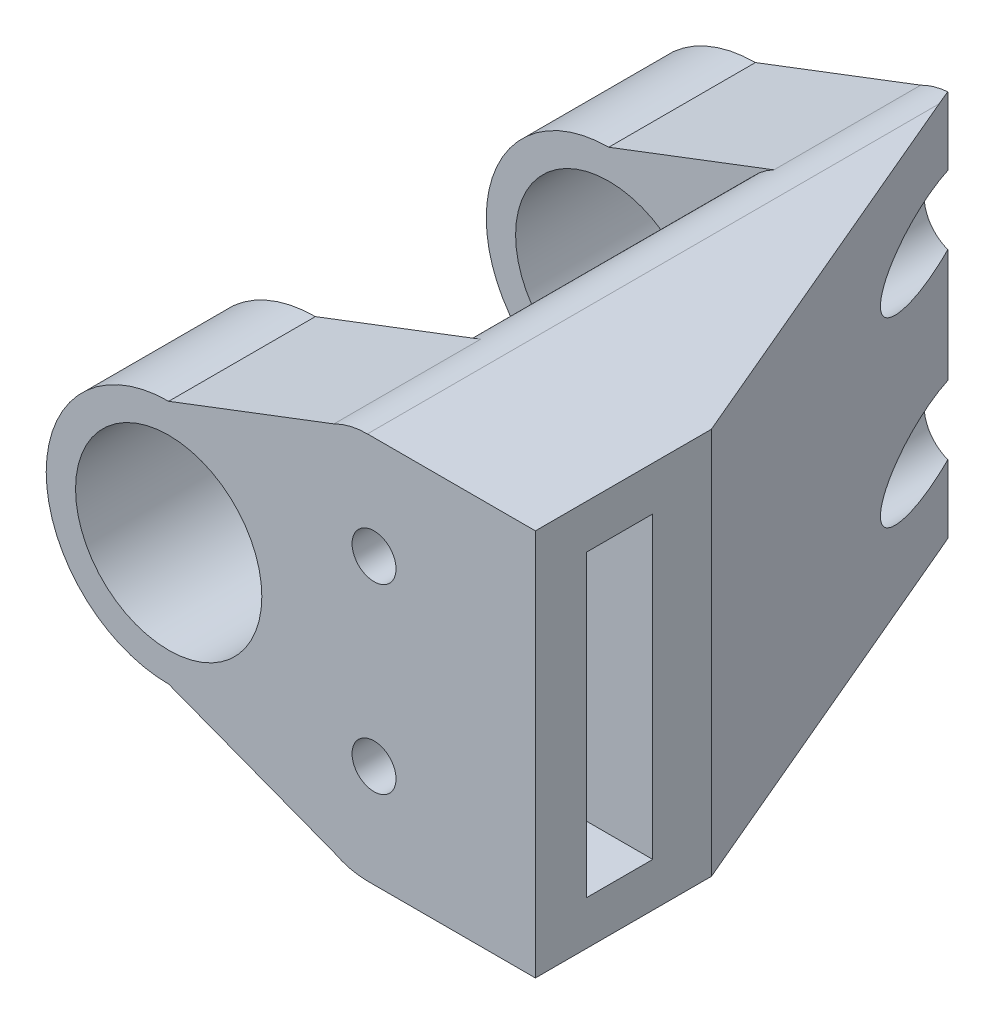
ISO-10303-21;
HEADER;
FILE_DESCRIPTION(('STEP AP214'),'2;1');
FILE_NAME('part.step','',(''),(''),'','','');
FILE_SCHEMA(('AUTOMOTIVE_DESIGN { 1 0 10303 214 1 1 1 1 }'));
ENDSEC;
DATA;
#1=APPLICATION_CONTEXT('core data for automotive mechanical design processes');
#2=APPLICATION_PROTOCOL_DEFINITION('international standard','automotive_design',2000,#1);
#3=PRODUCT_CONTEXT('',#1,'mechanical');
#4=PRODUCT('Part','Part','',(#3));
#5=PRODUCT_RELATED_PRODUCT_CATEGORY('part','',(#4));
#6=PRODUCT_DEFINITION_FORMATION('','',#4);
#7=PRODUCT_DEFINITION_CONTEXT('part definition',#1,'design');
#8=PRODUCT_DEFINITION('design','',#6,#7);
#9=PRODUCT_DEFINITION_SHAPE('','',#8);
#10=(LENGTH_UNIT() NAMED_UNIT(*) SI_UNIT(.MILLI.,.METRE.));
#11=(NAMED_UNIT(*) PLANE_ANGLE_UNIT() SI_UNIT($,.RADIAN.));
#12=(NAMED_UNIT(*) SI_UNIT($,.STERADIAN.) SOLID_ANGLE_UNIT());
#13=UNCERTAINTY_MEASURE_WITH_UNIT(LENGTH_MEASURE(1.E-05),#10,'distance_accuracy_value','');
#14=(GEOMETRIC_REPRESENTATION_CONTEXT(3) GLOBAL_UNCERTAINTY_ASSIGNED_CONTEXT((#13)) GLOBAL_UNIT_ASSIGNED_CONTEXT((#10,
#11,#12)) REPRESENTATION_CONTEXT('',''));
#15=CARTESIAN_POINT('',(0.,0.,0.));
#16=DIRECTION('',(0.,0.,1.));
#17=DIRECTION('',(1.,0.,0.));
#18=AXIS2_PLACEMENT_3D('',#15,#16,#17);
#19=CARTESIAN_POINT('',(4.,-6.2,-40.));
#20=DIRECTION('',(0.,0.,1.));
#21=DIRECTION('',(1.,0.,0.));
#22=AXIS2_PLACEMENT_3D('',#19,#20,#21);
#23=CYLINDRICAL_SURFACE('',#22,1.5);
#24=CARTESIAN_POINT('',(4.,-6.2,-8.));
#25=DIRECTION('',(0.,0.,1.));
#26=DIRECTION('',(1.,0.,0.));
#27=AXIS2_PLACEMENT_3D('',#24,#25,#26);
#28=CIRCLE('',#27,1.5);
#29=CARTESIAN_POINT('',(5.5,-6.2,-8.));
#30=VERTEX_POINT('',#29);
#31=EDGE_CURVE('E219',#30,#30,#28,.T.);
#32=ORIENTED_EDGE('',*,*,#31,.T.);
#33=EDGE_LOOP('',(#32));
#34=FACE_BOUND('',#33,.T.);
#35=CARTESIAN_POINT('',(4.,-6.2,-20.));
#36=DIRECTION('',(0.,0.,-1.));
#37=DIRECTION('',(-1.,0.,0.));
#38=AXIS2_PLACEMENT_3D('',#35,#36,#37);
#39=CIRCLE('',#38,1.5);
#40=CARTESIAN_POINT('',(2.5,-6.2,-20.));
#41=VERTEX_POINT('',#40);
#42=EDGE_CURVE('E121',#41,#41,#39,.F.);
#43=ORIENTED_EDGE('',*,*,#42,.F.);
#44=EDGE_LOOP('',(#43));
#45=FACE_BOUND('',#44,.T.);
#46=ADVANCED_FACE('F50',(#34,#45),#23,.F.);
#47=CARTESIAN_POINT('',(4.,6.2,-40.));
#48=DIRECTION('',(0.,0.,1.));
#49=DIRECTION('',(1.,0.,0.));
#50=AXIS2_PLACEMENT_3D('',#47,#48,#49);
#51=CYLINDRICAL_SURFACE('',#50,1.5);
#52=CARTESIAN_POINT('',(4.,6.2,-8.));
#53=DIRECTION('',(0.,0.,1.));
#54=DIRECTION('',(1.,0.,0.));
#55=AXIS2_PLACEMENT_3D('',#52,#53,#54);
#56=CIRCLE('',#55,1.5);
#57=CARTESIAN_POINT('',(5.5,6.2,-8.));
#58=VERTEX_POINT('',#57);
#59=EDGE_CURVE('E222',#58,#58,#56,.T.);
#60=ORIENTED_EDGE('',*,*,#59,.T.);
#61=EDGE_LOOP('',(#60));
#62=FACE_BOUND('',#61,.T.);
#63=CARTESIAN_POINT('',(4.,6.2,-20.));
#64=DIRECTION('',(0.,0.,-1.));
#65=DIRECTION('',(-1.,0.,0.));
#66=AXIS2_PLACEMENT_3D('',#63,#64,#65);
#67=CIRCLE('',#66,1.5);
#68=CARTESIAN_POINT('',(2.5,6.2,-20.));
#69=VERTEX_POINT('',#68);
#70=EDGE_CURVE('E118',#69,#69,#67,.F.);
#71=ORIENTED_EDGE('',*,*,#70,.F.);
#72=EDGE_LOOP('',(#71));
#73=FACE_BOUND('',#72,.T.);
#74=ADVANCED_FACE('F482',(#62,#73),#51,.F.);
#75=CARTESIAN_POINT('',(0.,13.2,-40.));
#76=DIRECTION('',(0.,-1.,0.));
#77=DIRECTION('',(0.,0.,-1.));
#78=AXIS2_PLACEMENT_3D('',#75,#76,#77);
#79=PLANE('',#78);
#80=DIRECTION('',(0.,0.,1.));
#81=VECTOR('',#80,1.);
#82=CARTESIAN_POINT('',(15.,13.2,-40.));
#83=LINE('',#82,#81);
#84=CARTESIAN_POINT('',(15.,13.2,-11.9999999999998));
#85=VERTEX_POINT('',#84);
#86=CARTESIAN_POINT('',(15.,13.2,0.));
#87=VERTEX_POINT('',#86);
#88=EDGE_CURVE('E290',#85,#87,#83,.T.);
#89=ORIENTED_EDGE('',*,*,#88,.F.);
#90=DIRECTION('',(-0.390731128489272,0.,-0.920504853452441));
#91=VECTOR('',#90,1.);
#92=CARTESIAN_POINT('',(15.,13.2,-11.9999999999998));
#93=LINE('',#92,#91);
#94=CARTESIAN_POINT('',(3.54980067833786,13.2,-38.9749791610912));
#95=VERTEX_POINT('',#94);
#96=EDGE_CURVE('E109',#85,#95,#93,.T.);
#97=ORIENTED_EDGE('',*,*,#96,.T.);
#98=DIRECTION('',(0.,0.,1.));
#99=VECTOR('',#98,1.);
#100=CARTESIAN_POINT('',(3.54980067833786,13.2,-40.));
#101=LINE('',#100,#99);
#102=CARTESIAN_POINT('',(3.54980067833786,13.2,0.));
#103=VERTEX_POINT('',#102);
#104=EDGE_CURVE('E293',#95,#103,#101,.T.);
#105=ORIENTED_EDGE('',*,*,#104,.T.);
#106=DIRECTION('',(1.,0.,0.));
#107=VECTOR('',#106,1.);
#108=CARTESIAN_POINT('',(0.,13.2,0.));
#109=LINE('',#108,#107);
#110=EDGE_CURVE('E276',#103,#87,#109,.T.);
#111=ORIENTED_EDGE('',*,*,#110,.T.);
#112=EDGE_LOOP('',(#89,#97,#105,#111));
#113=FACE_BOUND('',#112,.T.);
#114=ADVANCED_FACE('F334',(#113),#79,.F.);
#115=CARTESIAN_POINT('',(0.,-13.2,-40.));
#116=DIRECTION('',(0.,1.,0.));
#117=DIRECTION('',(0.,0.,1.));
#118=AXIS2_PLACEMENT_3D('',#115,#116,#117);
#119=PLANE('',#118);
#120=DIRECTION('',(0.,0.,1.));
#121=VECTOR('',#120,1.);
#122=CARTESIAN_POINT('',(3.54980067833786,-13.2,-40.));
#123=LINE('',#122,#121);
#124=CARTESIAN_POINT('',(3.54980067833787,-13.2,0.));
#125=VERTEX_POINT('',#124);
#126=CARTESIAN_POINT('',(3.54980067833786,-13.2,-38.9749791610912));
#127=VERTEX_POINT('',#126);
#128=EDGE_CURVE('E308',#125,#127,#123,.F.);
#129=ORIENTED_EDGE('',*,*,#128,.T.);
#130=DIRECTION('',(0.390731128489272,0.,0.920504853452441));
#131=VECTOR('',#130,1.);
#132=CARTESIAN_POINT('',(15.,-13.2,-11.9999999999998));
#133=LINE('',#132,#131);
#134=CARTESIAN_POINT('',(15.,-13.2,-11.9999999999998));
#135=VERTEX_POINT('',#134);
#136=EDGE_CURVE('E88',#127,#135,#133,.T.);
#137=ORIENTED_EDGE('',*,*,#136,.T.);
#138=DIRECTION('',(0.,0.,1.));
#139=VECTOR('',#138,1.);
#140=CARTESIAN_POINT('',(15.,-13.2,-40.));
#141=LINE('',#140,#139);
#142=CARTESIAN_POINT('',(15.,-13.2,0.));
#143=VERTEX_POINT('',#142);
#144=EDGE_CURVE('E272',#135,#143,#141,.T.);
#145=ORIENTED_EDGE('',*,*,#144,.T.);
#146=DIRECTION('',(-1.,0.,0.));
#147=VECTOR('',#146,1.);
#148=CARTESIAN_POINT('',(0.,-13.2,0.));
#149=LINE('',#148,#147);
#150=EDGE_CURVE('E279',#143,#125,#149,.T.);
#151=ORIENTED_EDGE('',*,*,#150,.T.);
#152=EDGE_LOOP('',(#129,#137,#145,#151));
#153=FACE_BOUND('',#152,.T.);
#154=ADVANCED_FACE('F437',(#153),#119,.F.);
#155=CARTESIAN_POINT('',(-10.,0.,-40.));
#156=DIRECTION('',(0.,0.,1.));
#157=DIRECTION('',(1.,0.,0.));
#158=AXIS2_PLACEMENT_3D('',#155,#156,#157);
#159=CYLINDRICAL_SURFACE('',#158,6.35);
#160=CARTESIAN_POINT('',(-10.,0.,-40.));
#161=DIRECTION('',(0.,0.,1.));
#162=DIRECTION('',(1.,0.,0.));
#163=AXIS2_PLACEMENT_3D('',#160,#161,#162);
#164=CIRCLE('',#163,6.35);
#165=CARTESIAN_POINT('',(-3.65,0.,-40.));
#166=VERTEX_POINT('',#165);
#167=EDGE_CURVE('E269',#166,#166,#164,.T.);
#168=ORIENTED_EDGE('',*,*,#167,.F.);
#169=EDGE_LOOP('',(#168));
#170=FACE_BOUND('',#169,.T.);
#171=CARTESIAN_POINT('',(-10.,0.,-30.));
#172=DIRECTION('',(0.,0.,1.));
#173=DIRECTION('',(1.,0.,0.));
#174=AXIS2_PLACEMENT_3D('',#171,#172,#173);
#175=CIRCLE('',#174,6.35);
#176=CARTESIAN_POINT('',(-3.65,0.,-30.));
#177=VERTEX_POINT('',#176);
#178=EDGE_CURVE('E243',#177,#177,#175,.F.);
#179=ORIENTED_EDGE('',*,*,#178,.F.);
#180=EDGE_LOOP('',(#179));
#181=FACE_BOUND('',#180,.T.);
#182=ADVANCED_FACE('F504',(#170,#181),#159,.F.);
#183=CARTESIAN_POINT('',(15.,0.,-40.));
#184=DIRECTION('',(1.,0.,0.));
#185=DIRECTION('',(0.,1.,0.));
#186=AXIS2_PLACEMENT_3D('',#183,#184,#185);
#187=PLANE('',#186);
#188=ORIENTED_EDGE('',*,*,#144,.F.);
#189=DIRECTION('',(0.,1.,0.));
#190=VECTOR('',#189,1.);
#191=CARTESIAN_POINT('',(15.,13.2,-11.9999999999998));
#192=LINE('',#191,#190);
#193=EDGE_CURVE('E326',#135,#85,#192,.T.);
#194=ORIENTED_EDGE('',*,*,#193,.T.);
#195=ORIENTED_EDGE('',*,*,#88,.T.);
#196=DIRECTION('',(0.,1.,0.));
#197=VECTOR('',#196,1.);
#198=CARTESIAN_POINT('',(15.,0.,0.));
#199=LINE('',#198,#197);
#200=EDGE_CURVE('E282',#143,#87,#199,.T.);
#201=ORIENTED_EDGE('',*,*,#200,.F.);
#202=EDGE_LOOP('',(#188,#194,#195,#201));
#203=FACE_BOUND('',#202,.T.);
#204=DIRECTION('',(0.,0.,1.));
#205=VECTOR('',#204,1.);
#206=CARTESIAN_POINT('',(15.,10.2,-8.));
#207=LINE('',#206,#205);
#208=CARTESIAN_POINT('',(15.,10.2,-8.));
#209=VERTEX_POINT('',#208);
#210=CARTESIAN_POINT('',(15.,10.2,-3.5));
#211=VERTEX_POINT('',#210);
#212=EDGE_CURVE('E261',#209,#211,#207,.T.);
#213=ORIENTED_EDGE('',*,*,#212,.F.);
#214=DIRECTION('',(0.,1.,0.));
#215=VECTOR('',#214,1.);
#216=CARTESIAN_POINT('',(15.,0.,-8.));
#217=LINE('',#216,#215);
#218=CARTESIAN_POINT('',(15.,-10.2,-8.));
#219=VERTEX_POINT('',#218);
#220=EDGE_CURVE('E232',#219,#209,#217,.T.);
#221=ORIENTED_EDGE('',*,*,#220,.F.);
#222=DIRECTION('',(0.,0.,1.));
#223=VECTOR('',#222,1.);
#224=CARTESIAN_POINT('',(15.,-10.2,-8.));
#225=LINE('',#224,#223);
#226=CARTESIAN_POINT('',(15.,-10.2,-3.5));
#227=VERTEX_POINT('',#226);
#228=EDGE_CURVE('E264',#219,#227,#225,.T.);
#229=ORIENTED_EDGE('',*,*,#228,.T.);
#230=DIRECTION('',(0.,1.,0.));
#231=VECTOR('',#230,1.);
#232=CARTESIAN_POINT('',(15.,0.,-3.5));
#233=LINE('',#232,#231);
#234=EDGE_CURVE('E252',#227,#211,#233,.T.);
#235=ORIENTED_EDGE('',*,*,#234,.T.);
#236=EDGE_LOOP('',(#213,#221,#229,#235));
#237=FACE_BOUND('',#236,.T.);
#238=ADVANCED_FACE('F441',(#203,#237),#187,.T.);
#239=CARTESIAN_POINT('',(4.,-6.2,-3.5));
#240=DIRECTION('',(0.,0.,1.));
#241=DIRECTION('',(1.,0.,0.));
#242=AXIS2_PLACEMENT_3D('',#239,#240,#241);
#243=CIRCLE('',#242,1.5);
#244=CARTESIAN_POINT('',(5.5,-6.2,-3.5));
#245=VERTEX_POINT('',#244);
#246=EDGE_CURVE('E239',#245,#245,#243,.T.);
#247=ORIENTED_EDGE('',*,*,#246,.F.);
#248=EDGE_LOOP('',(#247));
#249=FACE_BOUND('',#248,.T.);
#250=CARTESIAN_POINT('',(4.,-6.2,0.));
#251=DIRECTION('',(0.,0.,1.));
#252=DIRECTION('',(1.,0.,0.));
#253=AXIS2_PLACEMENT_3D('',#250,#251,#252);
#254=CIRCLE('',#253,1.5);
#255=CARTESIAN_POINT('',(5.5,-6.2,0.));
#256=VERTEX_POINT('',#255);
#257=EDGE_CURVE('E285',#256,#256,#254,.T.);
#258=ORIENTED_EDGE('',*,*,#257,.T.);
#259=EDGE_LOOP('',(#258));
#260=FACE_BOUND('',#259,.T.);
#261=ADVANCED_FACE('F485',(#249,#260),#23,.F.);
#262=CARTESIAN_POINT('',(-10.,0.,-10.));
#263=DIRECTION('',(0.,0.,1.));
#264=DIRECTION('',(1.,0.,0.));
#265=AXIS2_PLACEMENT_3D('',#262,#263,#264);
#266=CIRCLE('',#265,6.35);
#267=CARTESIAN_POINT('',(-3.65,0.,-10.));
#268=VERTEX_POINT('',#267);
#269=EDGE_CURVE('E216',#268,#268,#266,.F.);
#270=ORIENTED_EDGE('',*,*,#269,.T.);
#271=EDGE_LOOP('',(#270));
#272=FACE_BOUND('',#271,.T.);
#273=CARTESIAN_POINT('',(-10.,0.,0.));
#274=DIRECTION('',(0.,0.,1.));
#275=DIRECTION('',(1.,0.,0.));
#276=AXIS2_PLACEMENT_3D('',#273,#274,#275);
#277=CIRCLE('',#276,6.35);
#278=CARTESIAN_POINT('',(-3.65,0.,0.));
#279=VERTEX_POINT('',#278);
#280=EDGE_CURVE('E260',#279,#279,#277,.T.);
#281=ORIENTED_EDGE('',*,*,#280,.T.);
#282=EDGE_LOOP('',(#281));
#283=FACE_BOUND('',#282,.T.);
#284=ADVANCED_FACE('F496',(#272,#283),#159,.F.);
#285=CARTESIAN_POINT('',(4.,6.2,-3.5));
#286=DIRECTION('',(0.,0.,1.));
#287=DIRECTION('',(1.,0.,0.));
#288=AXIS2_PLACEMENT_3D('',#285,#286,#287);
#289=CIRCLE('',#288,1.5);
#290=CARTESIAN_POINT('',(5.5,6.2,-3.5));
#291=VERTEX_POINT('',#290);
#292=EDGE_CURVE('E242',#291,#291,#289,.T.);
#293=ORIENTED_EDGE('',*,*,#292,.F.);
#294=EDGE_LOOP('',(#293));
#295=FACE_BOUND('',#294,.T.);
#296=CARTESIAN_POINT('',(4.,6.2,0.));
#297=DIRECTION('',(0.,0.,1.));
#298=DIRECTION('',(1.,0.,0.));
#299=AXIS2_PLACEMENT_3D('',#296,#297,#298);
#300=CIRCLE('',#299,1.5);
#301=CARTESIAN_POINT('',(5.5,6.2,0.));
#302=VERTEX_POINT('',#301);
#303=EDGE_CURVE('E273',#302,#302,#300,.T.);
#304=ORIENTED_EDGE('',*,*,#303,.T.);
#305=EDGE_LOOP('',(#304));
#306=FACE_BOUND('',#305,.T.);
#307=ADVANCED_FACE('F492',(#295,#306),#51,.F.);
#308=CARTESIAN_POINT('',(0.,0.,-40.));
#309=DIRECTION('',(0.,0.,1.));
#310=DIRECTION('',(1.,0.,0.));
#311=AXIS2_PLACEMENT_3D('',#308,#309,#310);
#312=PLANE('',#311);
#313=CARTESIAN_POINT('',(4.,6.2,-40.));
#314=DIRECTION('',(0.,0.,1.));
#315=DIRECTION('',(1.,0.,0.));
#316=AXIS2_PLACEMENT_3D('',#313,#314,#315);
#317=CIRCLE('',#316,2.5);
#318=CARTESIAN_POINT('',(3.11470514613105,3.86199807063528,-40.));
#319=VERTEX_POINT('',#318);
#320=CARTESIAN_POINT('',(3.11470514613105,8.53800192936472,-40.));
#321=VERTEX_POINT('',#320);
#322=EDGE_CURVE('E55',#319,#321,#317,.F.);
#323=ORIENTED_EDGE('',*,*,#322,.F.);
#324=DIRECTION('',(0.,-1.,0.));
#325=VECTOR('',#324,1.);
#326=CARTESIAN_POINT('',(3.11470514613105,-13.2,-40.));
#327=LINE('',#326,#325);
#328=CARTESIAN_POINT('',(3.11470514613105,-3.86199807063528,-40.));
#329=VERTEX_POINT('',#328);
#330=EDGE_CURVE('E98',#319,#329,#327,.T.);
#331=ORIENTED_EDGE('',*,*,#330,.T.);
#332=CARTESIAN_POINT('',(4.,-6.2,-40.));
#333=DIRECTION('',(0.,0.,1.));
#334=DIRECTION('',(1.,0.,0.));
#335=AXIS2_PLACEMENT_3D('',#332,#333,#334);
#336=CIRCLE('',#335,2.5);
#337=CARTESIAN_POINT('',(3.11470514613105,-8.53800192936472,-40.));
#338=VERTEX_POINT('',#337);
#339=EDGE_CURVE('E68',#338,#329,#336,.F.);
#340=ORIENTED_EDGE('',*,*,#339,.F.);
#341=DIRECTION('',(0.,-1.,0.));
#342=VECTOR('',#341,1.);
#343=CARTESIAN_POINT('',(3.11470514613105,-13.2,-40.));
#344=LINE('',#343,#342);
#345=CARTESIAN_POINT('',(3.11470514613105,-13.1810332138878,-40.));
#346=VERTEX_POINT('',#345);
#347=EDGE_CURVE('E96',#338,#346,#344,.T.);
#348=ORIENTED_EDGE('',*,*,#347,.T.);
#349=CARTESIAN_POINT('',(3.54980067833786,-8.19999999999999,-40.));
#350=DIRECTION('',(0.,0.,-1.));
#351=DIRECTION('',(-1.,0.,0.));
#352=AXIS2_PLACEMENT_3D('',#349,#350,#351);
#353=CIRCLE('',#352,5.);
#354=CARTESIAN_POINT('',(1.26611394631409,-12.6480079709886,-40.));
#355=VERTEX_POINT('',#354);
#356=EDGE_CURVE('E158',#346,#355,#353,.T.);
#357=ORIENTED_EDGE('',*,*,#356,.T.);
#358=DIRECTION('',(-0.934317816289365,0.356441044443919,0.));
#359=VECTOR('',#358,1.);
#360=CARTESIAN_POINT('',(-9.99999999999999,-8.35,-40.));
#361=LINE('',#360,#359);
#362=CARTESIAN_POINT('',(-9.99999999999999,-8.35,-40.));
#363=VERTEX_POINT('',#362);
#364=EDGE_CURVE('E160',#355,#363,#361,.T.);
#365=ORIENTED_EDGE('',*,*,#364,.T.);
#366=CARTESIAN_POINT('',(-10.,0.,-40.));
#367=DIRECTION('',(0.,0.,-1.));
#368=DIRECTION('',(1.,0.,0.));
#369=AXIS2_PLACEMENT_3D('',#366,#367,#368);
#370=CIRCLE('',#369,8.35);
#371=CARTESIAN_POINT('',(-10.,8.34999999999999,-40.));
#372=VERTEX_POINT('',#371);
#373=EDGE_CURVE('E149',#363,#372,#370,.T.);
#374=ORIENTED_EDGE('',*,*,#373,.T.);
#375=DIRECTION('',(0.934317816289365,0.356441044443919,0.));
#376=VECTOR('',#375,1.);
#377=CARTESIAN_POINT('',(-10.,8.34999999999999,-40.));
#378=LINE('',#377,#376);
#379=CARTESIAN_POINT('',(1.26611394631408,12.6480079709886,-40.));
#380=VERTEX_POINT('',#379);
#381=EDGE_CURVE('E152',#372,#380,#378,.T.);
#382=ORIENTED_EDGE('',*,*,#381,.T.);
#383=CARTESIAN_POINT('',(3.54980067833786,8.19999999999999,-40.));
#384=DIRECTION('',(0.,0.,-1.));
#385=DIRECTION('',(1.,0.,0.));
#386=AXIS2_PLACEMENT_3D('',#383,#384,#385);
#387=CIRCLE('',#386,5.);
#388=CARTESIAN_POINT('',(3.11470514613105,13.1810332138878,-40.));
#389=VERTEX_POINT('',#388);
#390=EDGE_CURVE('E155',#380,#389,#387,.T.);
#391=ORIENTED_EDGE('',*,*,#390,.T.);
#392=DIRECTION('',(0.,-1.,0.));
#393=VECTOR('',#392,1.);
#394=CARTESIAN_POINT('',(3.11470514613105,-13.2,-40.));
#395=LINE('',#394,#393);
#396=EDGE_CURVE('E106',#389,#321,#395,.T.);
#397=ORIENTED_EDGE('',*,*,#396,.T.);
#398=EDGE_LOOP('',(#323,#331,#340,#348,#357,#365,#374,#382,#391,#397));
#399=FACE_BOUND('',#398,.T.);
#400=ORIENTED_EDGE('',*,*,#167,.T.);
#401=EDGE_LOOP('',(#400));
#402=FACE_BOUND('',#401,.T.);
#403=ADVANCED_FACE('F92',(#399,#402),#312,.F.);
#404=CARTESIAN_POINT('',(0.,0.,0.));
#405=DIRECTION('',(0.,0.,1.));
#406=DIRECTION('',(1.,0.,0.));
#407=AXIS2_PLACEMENT_3D('',#404,#405,#406);
#408=PLANE('',#407);
#409=CARTESIAN_POINT('',(3.54980067833786,-8.19999999999999,0.));
#410=DIRECTION('',(0.,0.,-1.));
#411=DIRECTION('',(-1.,0.,0.));
#412=AXIS2_PLACEMENT_3D('',#409,#410,#411);
#413=CIRCLE('',#412,5.);
#414=CARTESIAN_POINT('',(1.26611394631409,-12.6480079709886,0.));
#415=VERTEX_POINT('',#414);
#416=EDGE_CURVE('E143',#125,#415,#413,.T.);
#417=ORIENTED_EDGE('',*,*,#416,.F.);
#418=ORIENTED_EDGE('',*,*,#150,.F.);
#419=ORIENTED_EDGE('',*,*,#200,.T.);
#420=ORIENTED_EDGE('',*,*,#110,.F.);
#421=CARTESIAN_POINT('',(3.54980067833786,8.19999999999999,0.));
#422=DIRECTION('',(0.,0.,-1.));
#423=DIRECTION('',(1.,0.,0.));
#424=AXIS2_PLACEMENT_3D('',#421,#422,#423);
#425=CIRCLE('',#424,5.);
#426=CARTESIAN_POINT('',(1.26611394631408,12.6480079709886,0.));
#427=VERTEX_POINT('',#426);
#428=EDGE_CURVE('E135',#427,#103,#425,.T.);
#429=ORIENTED_EDGE('',*,*,#428,.F.);
#430=DIRECTION('',(0.934317816289365,0.356441044443919,0.));
#431=VECTOR('',#430,1.);
#432=CARTESIAN_POINT('',(-10.,8.34999999999999,0.));
#433=LINE('',#432,#431);
#434=CARTESIAN_POINT('',(-10.,8.34999999999999,0.));
#435=VERTEX_POINT('',#434);
#436=EDGE_CURVE('E127',#435,#427,#433,.T.);
#437=ORIENTED_EDGE('',*,*,#436,.F.);
#438=CARTESIAN_POINT('',(-10.,0.,0.));
#439=DIRECTION('',(0.,0.,-1.));
#440=DIRECTION('',(1.,0.,0.));
#441=AXIS2_PLACEMENT_3D('',#438,#439,#440);
#442=CIRCLE('',#441,8.35);
#443=CARTESIAN_POINT('',(-9.99999999999999,-8.35,0.));
#444=VERTEX_POINT('',#443);
#445=EDGE_CURVE('E123',#444,#435,#442,.T.);
#446=ORIENTED_EDGE('',*,*,#445,.F.);
#447=DIRECTION('',(-0.934317816289365,0.356441044443919,0.));
#448=VECTOR('',#447,1.);
#449=CARTESIAN_POINT('',(-9.99999999999999,-8.35,0.));
#450=LINE('',#449,#448);
#451=EDGE_CURVE('E146',#415,#444,#450,.T.);
#452=ORIENTED_EDGE('',*,*,#451,.F.);
#453=EDGE_LOOP('',(#417,#418,#419,#420,#429,#437,#446,#452));
#454=FACE_BOUND('',#453,.T.);
#455=ORIENTED_EDGE('',*,*,#280,.F.);
#456=EDGE_LOOP('',(#455));
#457=FACE_BOUND('',#456,.T.);
#458=ORIENTED_EDGE('',*,*,#257,.F.);
#459=EDGE_LOOP('',(#458));
#460=FACE_BOUND('',#459,.T.);
#461=ORIENTED_EDGE('',*,*,#303,.F.);
#462=EDGE_LOOP('',(#461));
#463=FACE_BOUND('',#462,.T.);
#464=ADVANCED_FACE('F445',(#454,#457,#460,#463),#408,.T.);
#465=CARTESIAN_POINT('',(0.,0.,-8.));
#466=DIRECTION('',(1.,0.,0.));
#467=DIRECTION('',(0.,1.,0.));
#468=AXIS2_PLACEMENT_3D('',#465,#466,#467);
#469=PLANE('',#468);
#470=DIRECTION('',(0.,1.,0.));
#471=VECTOR('',#470,1.);
#472=CARTESIAN_POINT('',(0.,0.,-3.5));
#473=LINE('',#472,#471);
#474=CARTESIAN_POINT('',(0.,-10.2,-3.5));
#475=VERTEX_POINT('',#474);
#476=CARTESIAN_POINT('',(0.,10.2,-3.5));
#477=VERTEX_POINT('',#476);
#478=EDGE_CURVE('E246',#475,#477,#473,.T.);
#479=ORIENTED_EDGE('',*,*,#478,.F.);
#480=DIRECTION('',(0.,0.,1.));
#481=VECTOR('',#480,1.);
#482=CARTESIAN_POINT('',(0.,-10.2,-8.));
#483=LINE('',#482,#481);
#484=CARTESIAN_POINT('',(0.,-10.2,-8.));
#485=VERTEX_POINT('',#484);
#486=EDGE_CURVE('E238',#485,#475,#483,.T.);
#487=ORIENTED_EDGE('',*,*,#486,.F.);
#488=DIRECTION('',(0.,1.,0.));
#489=VECTOR('',#488,1.);
#490=CARTESIAN_POINT('',(0.,0.,-8.));
#491=LINE('',#490,#489);
#492=CARTESIAN_POINT('',(0.,10.2,-8.));
#493=VERTEX_POINT('',#492);
#494=EDGE_CURVE('E226',#485,#493,#491,.T.);
#495=ORIENTED_EDGE('',*,*,#494,.T.);
#496=DIRECTION('',(0.,0.,1.));
#497=VECTOR('',#496,1.);
#498=CARTESIAN_POINT('',(0.,10.2,-8.));
#499=LINE('',#498,#497);
#500=EDGE_CURVE('E257',#493,#477,#499,.T.);
#501=ORIENTED_EDGE('',*,*,#500,.T.);
#502=EDGE_LOOP('',(#479,#487,#495,#501));
#503=FACE_BOUND('',#502,.T.);
#504=ADVANCED_FACE('F512',(#503),#469,.T.);
#505=CARTESIAN_POINT('',(0.,10.2,-8.));
#506=DIRECTION('',(0.,1.,0.));
#507=DIRECTION('',(-1.,0.,0.));
#508=AXIS2_PLACEMENT_3D('',#505,#506,#507);
#509=PLANE('',#508);
#510=DIRECTION('',(-1.,0.,0.));
#511=VECTOR('',#510,1.);
#512=CARTESIAN_POINT('',(0.,10.2,-3.5));
#513=LINE('',#512,#511);
#514=EDGE_CURVE('E223',#211,#477,#513,.T.);
#515=ORIENTED_EDGE('',*,*,#514,.T.);
#516=ORIENTED_EDGE('',*,*,#500,.F.);
#517=DIRECTION('',(-1.,0.,0.));
#518=VECTOR('',#517,1.);
#519=CARTESIAN_POINT('',(0.,10.2,-8.));
#520=LINE('',#519,#518);
#521=EDGE_CURVE('E235',#209,#493,#520,.T.);
#522=ORIENTED_EDGE('',*,*,#521,.F.);
#523=ORIENTED_EDGE('',*,*,#212,.T.);
#524=EDGE_LOOP('',(#515,#516,#522,#523));
#525=FACE_BOUND('',#524,.T.);
#526=ADVANCED_FACE('F525',(#525),#509,.F.);
#527=CARTESIAN_POINT('',(0.,-10.2,-8.));
#528=DIRECTION('',(0.,1.,0.));
#529=DIRECTION('',(-1.,0.,0.));
#530=AXIS2_PLACEMENT_3D('',#527,#528,#529);
#531=PLANE('',#530);
#532=DIRECTION('',(-1.,0.,0.));
#533=VECTOR('',#532,1.);
#534=CARTESIAN_POINT('',(0.,-10.2,-3.5));
#535=LINE('',#534,#533);
#536=EDGE_CURVE('E249',#227,#475,#535,.T.);
#537=ORIENTED_EDGE('',*,*,#536,.F.);
#538=ORIENTED_EDGE('',*,*,#228,.F.);
#539=DIRECTION('',(-1.,0.,0.));
#540=VECTOR('',#539,1.);
#541=CARTESIAN_POINT('',(0.,-10.2,-8.));
#542=LINE('',#541,#540);
#543=EDGE_CURVE('E229',#219,#485,#542,.T.);
#544=ORIENTED_EDGE('',*,*,#543,.T.);
#545=ORIENTED_EDGE('',*,*,#486,.T.);
#546=EDGE_LOOP('',(#537,#538,#544,#545));
#547=FACE_BOUND('',#546,.T.);
#548=ADVANCED_FACE('F527',(#547),#531,.T.);
#549=CARTESIAN_POINT('',(0.,0.,-8.));
#550=DIRECTION('',(0.,0.,1.));
#551=DIRECTION('',(1.,0.,0.));
#552=AXIS2_PLACEMENT_3D('',#549,#550,#551);
#553=PLANE('',#552);
#554=ORIENTED_EDGE('',*,*,#31,.F.);
#555=EDGE_LOOP('',(#554));
#556=FACE_BOUND('',#555,.T.);
#557=ORIENTED_EDGE('',*,*,#59,.F.);
#558=EDGE_LOOP('',(#557));
#559=FACE_BOUND('',#558,.T.);
#560=ORIENTED_EDGE('',*,*,#494,.F.);
#561=ORIENTED_EDGE('',*,*,#543,.F.);
#562=ORIENTED_EDGE('',*,*,#220,.T.);
#563=ORIENTED_EDGE('',*,*,#521,.T.);
#564=EDGE_LOOP('',(#560,#561,#562,#563));
#565=FACE_BOUND('',#564,.T.);
#566=ADVANCED_FACE('F530',(#556,#559,#565),#553,.T.);
#567=CARTESIAN_POINT('',(0.,0.,-3.5));
#568=DIRECTION('',(0.,0.,1.));
#569=DIRECTION('',(1.,0.,0.));
#570=AXIS2_PLACEMENT_3D('',#567,#568,#569);
#571=PLANE('',#570);
#572=ORIENTED_EDGE('',*,*,#246,.T.);
#573=EDGE_LOOP('',(#572));
#574=FACE_BOUND('',#573,.T.);
#575=ORIENTED_EDGE('',*,*,#292,.T.);
#576=EDGE_LOOP('',(#575));
#577=FACE_BOUND('',#576,.T.);
#578=ORIENTED_EDGE('',*,*,#478,.T.);
#579=ORIENTED_EDGE('',*,*,#514,.F.);
#580=ORIENTED_EDGE('',*,*,#234,.F.);
#581=ORIENTED_EDGE('',*,*,#536,.T.);
#582=EDGE_LOOP('',(#578,#579,#580,#581));
#583=FACE_BOUND('',#582,.T.);
#584=ADVANCED_FACE('F535',(#574,#577,#583),#571,.F.);
#585=CARTESIAN_POINT('',(-10.,0.,-30.));
#586=DIRECTION('',(0.,0.,1.));
#587=DIRECTION('',(1.,0.,0.));
#588=AXIS2_PLACEMENT_3D('',#585,#586,#587);
#589=PLANE('',#588);
#590=DIRECTION('',(-0.934317816289366,0.356441044443919,0.));
#591=VECTOR('',#590,1.);
#592=CARTESIAN_POINT('',(-12.7807939726442,-7.28913067832834,-30.));
#593=LINE('',#592,#591);
#594=CARTESIAN_POINT('',(1.26611394631409,-12.6480079709886,-30.));
#595=VERTEX_POINT('',#594);
#596=CARTESIAN_POINT('',(-9.99999999999999,-8.35,-30.));
#597=VERTEX_POINT('',#596);
#598=EDGE_CURVE('E182',#595,#597,#593,.T.);
#599=ORIENTED_EDGE('',*,*,#598,.F.);
#600=CARTESIAN_POINT('',(3.54980067833786,-8.2,-30.));
#601=DIRECTION('',(0.,0.,1.));
#602=DIRECTION('',(1.,0.,0.));
#603=AXIS2_PLACEMENT_3D('',#600,#601,#602);
#604=CIRCLE('',#603,5.);
#605=CARTESIAN_POINT('',(-1.33240734905063,-7.12109093186526,-30.));
#606=VERTEX_POINT('',#605);
#607=EDGE_CURVE('E320',#595,#606,#604,.F.);
#608=ORIENTED_EDGE('',*,*,#607,.T.);
#609=DIRECTION('',(0.215781813626948,0.976441605477698,0.));
#610=VECTOR('',#609,1.);
#611=CARTESIAN_POINT('',(-0.235583945223017,-2.15781813626949,-30.));
#612=LINE('',#611,#610);
#613=CARTESIAN_POINT('',(-0.235583945223015,-2.15781813626949,-30.));
#614=VERTEX_POINT('',#613);
#615=EDGE_CURVE('E195',#606,#614,#612,.T.);
#616=ORIENTED_EDGE('',*,*,#615,.T.);
#617=CARTESIAN_POINT('',(-10.,0.,-30.));
#618=DIRECTION('',(0.,0.,1.));
#619=DIRECTION('',(1.,0.,0.));
#620=AXIS2_PLACEMENT_3D('',#617,#618,#619);
#621=CIRCLE('',#620,10.);
#622=CARTESIAN_POINT('',(-0.235583945223017,2.15781813626949,-30.));
#623=VERTEX_POINT('',#622);
#624=EDGE_CURVE('E198',#614,#623,#621,.T.);
#625=ORIENTED_EDGE('',*,*,#624,.T.);
#626=DIRECTION('',(-0.215781813626948,0.976441605477698,0.));
#627=VECTOR('',#626,1.);
#628=CARTESIAN_POINT('',(-0.235583945223017,2.15781813626949,-30.));
#629=LINE('',#628,#627);
#630=CARTESIAN_POINT('',(-1.33240734905063,7.12109093186525,-30.));
#631=VERTEX_POINT('',#630);
#632=EDGE_CURVE('E202',#623,#631,#629,.T.);
#633=ORIENTED_EDGE('',*,*,#632,.T.);
#634=CARTESIAN_POINT('',(3.54980067833786,8.19999999999999,-30.));
#635=DIRECTION('',(0.,0.,1.));
#636=DIRECTION('',(1.,0.,0.));
#637=AXIS2_PLACEMENT_3D('',#634,#635,#636);
#638=CIRCLE('',#637,5.);
#639=CARTESIAN_POINT('',(1.26611394631408,12.6480079709886,-30.));
#640=VERTEX_POINT('',#639);
#641=EDGE_CURVE('E314',#631,#640,#638,.F.);
#642=ORIENTED_EDGE('',*,*,#641,.T.);
#643=DIRECTION('',(0.934317816289365,0.356441044443919,0.));
#644=VECTOR('',#643,1.);
#645=CARTESIAN_POINT('',(-12.7807939726442,7.28913067832832,-30.));
#646=LINE('',#645,#644);
#647=CARTESIAN_POINT('',(-10.,8.34999999999999,-30.));
#648=VERTEX_POINT('',#647);
#649=EDGE_CURVE('E188',#648,#640,#646,.T.);
#650=ORIENTED_EDGE('',*,*,#649,.F.);
#651=CARTESIAN_POINT('',(-10.,0.,-30.));
#652=DIRECTION('',(0.,0.,1.));
#653=DIRECTION('',(1.,0.,0.));
#654=AXIS2_PLACEMENT_3D('',#651,#652,#653);
#655=CIRCLE('',#654,8.35);
#656=EDGE_CURVE('E191',#597,#648,#655,.F.);
#657=ORIENTED_EDGE('',*,*,#656,.F.);
#658=EDGE_LOOP('',(#599,#608,#616,#625,#633,#642,#650,#657));
#659=FACE_BOUND('',#658,.T.);
#660=ORIENTED_EDGE('',*,*,#178,.T.);
#661=EDGE_LOOP('',(#660));
#662=FACE_BOUND('',#661,.T.);
#663=ADVANCED_FACE('F538',(#659,#662),#589,.T.);
#664=CARTESIAN_POINT('',(-10.,0.,-10.));
#665=DIRECTION('',(0.,0.,1.));
#666=DIRECTION('',(1.,0.,0.));
#667=AXIS2_PLACEMENT_3D('',#664,#665,#666);
#668=PLANE('',#667);
#669=CARTESIAN_POINT('',(3.54980067833786,-8.2,-10.));
#670=DIRECTION('',(0.,0.,1.));
#671=DIRECTION('',(1.,0.,0.));
#672=AXIS2_PLACEMENT_3D('',#669,#670,#671);
#673=CIRCLE('',#672,5.);
#674=CARTESIAN_POINT('',(-1.33240734905063,-7.12109093186526,-10.));
#675=VERTEX_POINT('',#674);
#676=CARTESIAN_POINT('',(1.26611394631409,-12.6480079709886,-10.));
#677=VERTEX_POINT('',#676);
#678=EDGE_CURVE('E317',#675,#677,#673,.T.);
#679=ORIENTED_EDGE('',*,*,#678,.T.);
#680=DIRECTION('',(-0.934317816289366,0.356441044443919,0.));
#681=VECTOR('',#680,1.);
#682=CARTESIAN_POINT('',(-12.7807939726442,-7.28913067832834,-10.));
#683=LINE('',#682,#681);
#684=CARTESIAN_POINT('',(-9.99999999999999,-8.35,-10.));
#685=VERTEX_POINT('',#684);
#686=EDGE_CURVE('E167',#677,#685,#683,.T.);
#687=ORIENTED_EDGE('',*,*,#686,.T.);
#688=CARTESIAN_POINT('',(-10.,0.,-10.));
#689=DIRECTION('',(0.,0.,1.));
#690=DIRECTION('',(1.,0.,0.));
#691=AXIS2_PLACEMENT_3D('',#688,#689,#690);
#692=CIRCLE('',#691,8.35);
#693=CARTESIAN_POINT('',(-10.,8.34999999999999,-10.));
#694=VERTEX_POINT('',#693);
#695=EDGE_CURVE('E323',#685,#694,#692,.F.);
#696=ORIENTED_EDGE('',*,*,#695,.T.);
#697=DIRECTION('',(0.934317816289365,0.356441044443919,0.));
#698=VECTOR('',#697,1.);
#699=CARTESIAN_POINT('',(-12.7807939726442,7.28913067832832,-10.));
#700=LINE('',#699,#698);
#701=CARTESIAN_POINT('',(1.26611394631409,12.6480079709886,-10.));
#702=VERTEX_POINT('',#701);
#703=EDGE_CURVE('E185',#694,#702,#700,.T.);
#704=ORIENTED_EDGE('',*,*,#703,.T.);
#705=CARTESIAN_POINT('',(3.54980067833786,8.19999999999999,-10.));
#706=DIRECTION('',(0.,0.,1.));
#707=DIRECTION('',(1.,0.,0.));
#708=AXIS2_PLACEMENT_3D('',#705,#706,#707);
#709=CIRCLE('',#708,5.);
#710=CARTESIAN_POINT('',(-1.33240734905063,7.12109093186525,-10.));
#711=VERTEX_POINT('',#710);
#712=EDGE_CURVE('E311',#702,#711,#709,.T.);
#713=ORIENTED_EDGE('',*,*,#712,.T.);
#714=DIRECTION('',(-0.215781813626948,0.976441605477698,0.));
#715=VECTOR('',#714,1.);
#716=CARTESIAN_POINT('',(-0.235583945223017,2.15781813626949,-10.));
#717=LINE('',#716,#715);
#718=CARTESIAN_POINT('',(-0.235583945223017,2.15781813626949,-10.));
#719=VERTEX_POINT('',#718);
#720=EDGE_CURVE('E199',#719,#711,#717,.T.);
#721=ORIENTED_EDGE('',*,*,#720,.F.);
#722=CARTESIAN_POINT('',(-10.,0.,-10.));
#723=DIRECTION('',(0.,0.,1.));
#724=DIRECTION('',(1.,0.,0.));
#725=AXIS2_PLACEMENT_3D('',#722,#723,#724);
#726=CIRCLE('',#725,10.);
#727=CARTESIAN_POINT('',(-0.235583945223015,-2.15781813626949,-10.));
#728=VERTEX_POINT('',#727);
#729=EDGE_CURVE('E208',#728,#719,#726,.T.);
#730=ORIENTED_EDGE('',*,*,#729,.F.);
#731=DIRECTION('',(0.215781813626948,0.976441605477698,0.));
#732=VECTOR('',#731,1.);
#733=CARTESIAN_POINT('',(-0.235583945223017,-2.15781813626949,-10.));
#734=LINE('',#733,#732);
#735=EDGE_CURVE('E194',#675,#728,#734,.T.);
#736=ORIENTED_EDGE('',*,*,#735,.F.);
#737=EDGE_LOOP('',(#679,#687,#696,#704,#713,#721,#730,#736));
#738=FACE_BOUND('',#737,.T.);
#739=ORIENTED_EDGE('',*,*,#269,.F.);
#740=EDGE_LOOP('',(#739));
#741=FACE_BOUND('',#740,.T.);
#742=ADVANCED_FACE('F463',(#738,#741),#668,.F.);
#743=CARTESIAN_POINT('',(-0.235583945223017,2.15781813626949,-30.));
#744=DIRECTION('',(0.976441605477698,0.215781813626948,0.));
#745=DIRECTION('',(-0.215781813626948,0.976441605477698,0.));
#746=AXIS2_PLACEMENT_3D('',#743,#744,#745);
#747=PLANE('',#746);
#748=ORIENTED_EDGE('',*,*,#720,.T.);
#749=DIRECTION('',(0.,0.,1.));
#750=VECTOR('',#749,1.);
#751=CARTESIAN_POINT('',(-1.33240734905063,7.12109093186525,-30.));
#752=LINE('',#751,#750);
#753=EDGE_CURVE('E302',#711,#631,#752,.F.);
#754=ORIENTED_EDGE('',*,*,#753,.T.);
#755=ORIENTED_EDGE('',*,*,#632,.F.);
#756=DIRECTION('',(0.,0.,1.));
#757=VECTOR('',#756,1.);
#758=CARTESIAN_POINT('',(-0.235583945223017,2.15781813626949,-30.));
#759=LINE('',#758,#757);
#760=EDGE_CURVE('E213',#623,#719,#759,.T.);
#761=ORIENTED_EDGE('',*,*,#760,.T.);
#762=EDGE_LOOP('',(#748,#754,#755,#761));
#763=FACE_BOUND('',#762,.T.);
#764=ADVANCED_FACE('F550',(#763),#747,.F.);
#765=CARTESIAN_POINT('',(-10.,0.,-30.));
#766=DIRECTION('',(0.,0.,1.));
#767=DIRECTION('',(1.,0.,0.));
#768=AXIS2_PLACEMENT_3D('',#765,#766,#767);
#769=CYLINDRICAL_SURFACE('',#768,10.);
#770=ORIENTED_EDGE('',*,*,#729,.T.);
#771=ORIENTED_EDGE('',*,*,#760,.F.);
#772=ORIENTED_EDGE('',*,*,#624,.F.);
#773=DIRECTION('',(0.,0.,1.));
#774=VECTOR('',#773,1.);
#775=CARTESIAN_POINT('',(-0.235583945223015,-2.15781813626949,-30.));
#776=LINE('',#775,#774);
#777=EDGE_CURVE('E205',#614,#728,#776,.T.);
#778=ORIENTED_EDGE('',*,*,#777,.T.);
#779=EDGE_LOOP('',(#770,#771,#772,#778));
#780=FACE_BOUND('',#779,.T.);
#781=ADVANCED_FACE('F546',(#780),#769,.F.);
#782=CARTESIAN_POINT('',(-0.235583945223017,-2.15781813626949,-30.));
#783=DIRECTION('',(0.976441605477698,-0.215781813626948,0.));
#784=DIRECTION('',(0.215781813626948,0.976441605477698,0.));
#785=AXIS2_PLACEMENT_3D('',#782,#783,#784);
#786=PLANE('',#785);
#787=ORIENTED_EDGE('',*,*,#615,.F.);
#788=DIRECTION('',(0.,0.,1.));
#789=VECTOR('',#788,1.);
#790=CARTESIAN_POINT('',(-1.33240734905063,-7.12109093186526,-30.));
#791=LINE('',#790,#789);
#792=EDGE_CURVE('E305',#606,#675,#791,.T.);
#793=ORIENTED_EDGE('',*,*,#792,.T.);
#794=ORIENTED_EDGE('',*,*,#735,.T.);
#795=ORIENTED_EDGE('',*,*,#777,.F.);
#796=EDGE_LOOP('',(#787,#793,#794,#795));
#797=FACE_BOUND('',#796,.T.);
#798=ADVANCED_FACE('F543',(#797),#786,.F.);
#799=CARTESIAN_POINT('',(3.54980067833786,8.19999999999999,-40.));
#800=DIRECTION('',(0.,0.,1.));
#801=DIRECTION('',(1.,0.,0.));
#802=AXIS2_PLACEMENT_3D('',#799,#800,#801);
#803=CYLINDRICAL_SURFACE('',#802,5.);
#804=ORIENTED_EDGE('',*,*,#104,.F.);
#805=CARTESIAN_POINT('',(3.54980067833786,8.19999999999999,-38.9749791610912));
#806=DIRECTION('',(0.920504853452441,0.,-0.390731128489272));
#807=DIRECTION('',(0.390731128489272,0.,0.920504853452441));
#808=AXIS2_PLACEMENT_3D('',#805,#806,#807);
#809=ELLIPSE('',#808,12.7965233262373,5.);
#810=EDGE_CURVE('E104',#95,#389,#809,.F.);
#811=ORIENTED_EDGE('',*,*,#810,.T.);
#812=ORIENTED_EDGE('',*,*,#390,.F.);
#813=DIRECTION('',(0.,0.,1.));
#814=VECTOR('',#813,1.);
#815=CARTESIAN_POINT('',(1.26611394631408,12.6480079709886,-40.));
#816=LINE('',#815,#814);
#817=EDGE_CURVE('E173',#380,#640,#816,.T.);
#818=ORIENTED_EDGE('',*,*,#817,.T.);
#819=ORIENTED_EDGE('',*,*,#641,.F.);
#820=ORIENTED_EDGE('',*,*,#753,.F.);
#821=ORIENTED_EDGE('',*,*,#712,.F.);
#822=EDGE_CURVE('E176',#702,#427,#816,.T.);
#823=ORIENTED_EDGE('',*,*,#822,.T.);
#824=ORIENTED_EDGE('',*,*,#428,.T.);
#825=EDGE_LOOP('',(#804,#811,#812,#818,#819,#820,#821,#823,#824));
#826=FACE_BOUND('',#825,.T.);
#827=ADVANCED_FACE('F342',(#826),#803,.T.);
#828=CARTESIAN_POINT('',(3.54980067833786,-8.2,-30.));
#829=DIRECTION('',(0.,0.,1.));
#830=DIRECTION('',(1.,0.,0.));
#831=AXIS2_PLACEMENT_3D('',#828,#829,#830);
#832=CYLINDRICAL_SURFACE('',#831,5.);
#833=ORIENTED_EDGE('',*,*,#356,.F.);
#834=CARTESIAN_POINT('',(3.54980067833786,-8.2,-38.9749791610912));
#835=DIRECTION('',(0.920504853452441,0.,-0.390731128489272));
#836=DIRECTION('',(0.390731128489272,0.,0.920504853452441));
#837=AXIS2_PLACEMENT_3D('',#834,#835,#836);
#838=ELLIPSE('',#837,12.7965233262373,5.);
#839=EDGE_CURVE('E103',#346,#127,#838,.F.);
#840=ORIENTED_EDGE('',*,*,#839,.T.);
#841=ORIENTED_EDGE('',*,*,#128,.F.);
#842=ORIENTED_EDGE('',*,*,#416,.T.);
#843=DIRECTION('',(0.,0.,1.));
#844=VECTOR('',#843,1.);
#845=CARTESIAN_POINT('',(1.26611394631409,-12.6480079709886,-40.));
#846=LINE('',#845,#844);
#847=EDGE_CURVE('E172',#677,#415,#846,.T.);
#848=ORIENTED_EDGE('',*,*,#847,.F.);
#849=ORIENTED_EDGE('',*,*,#678,.F.);
#850=ORIENTED_EDGE('',*,*,#792,.F.);
#851=ORIENTED_EDGE('',*,*,#607,.F.);
#852=EDGE_CURVE('E169',#355,#595,#846,.T.);
#853=ORIENTED_EDGE('',*,*,#852,.F.);
#854=EDGE_LOOP('',(#833,#840,#841,#842,#848,#849,#850,#851,#853));
#855=FACE_BOUND('',#854,.T.);
#856=ADVANCED_FACE('F432',(#855),#832,.T.);
#857=CARTESIAN_POINT('',(-10.,8.34999999999999,-40.));
#858=DIRECTION('',(0.356441044443919,-0.934317816289365,0.));
#859=DIRECTION('',(0.934317816289365,0.356441044443919,0.));
#860=AXIS2_PLACEMENT_3D('',#857,#858,#859);
#861=PLANE('',#860);
#862=DIRECTION('',(0.,0.,1.));
#863=VECTOR('',#862,1.);
#864=CARTESIAN_POINT('',(-10.,8.34999999999999,-40.));
#865=LINE('',#864,#863);
#866=EDGE_CURVE('E163',#694,#435,#865,.T.);
#867=ORIENTED_EDGE('',*,*,#866,.T.);
#868=ORIENTED_EDGE('',*,*,#436,.T.);
#869=ORIENTED_EDGE('',*,*,#822,.F.);
#870=ORIENTED_EDGE('',*,*,#703,.F.);
#871=EDGE_LOOP('',(#867,#868,#869,#870));
#872=FACE_BOUND('',#871,.T.);
#873=ADVANCED_FACE('F459',(#872),#861,.F.);
#874=CARTESIAN_POINT('',(-9.99999999999999,-8.35,-40.));
#875=DIRECTION('',(0.356441044443919,0.934317816289365,0.));
#876=DIRECTION('',(-0.934317816289366,0.356441044443919,0.));
#877=AXIS2_PLACEMENT_3D('',#874,#875,#876);
#878=PLANE('',#877);
#879=ORIENTED_EDGE('',*,*,#847,.T.);
#880=ORIENTED_EDGE('',*,*,#451,.T.);
#881=DIRECTION('',(0.,0.,1.));
#882=VECTOR('',#881,1.);
#883=CARTESIAN_POINT('',(-9.99999999999999,-8.35,-40.));
#884=LINE('',#883,#882);
#885=EDGE_CURVE('E168',#685,#444,#884,.T.);
#886=ORIENTED_EDGE('',*,*,#885,.F.);
#887=ORIENTED_EDGE('',*,*,#686,.F.);
#888=EDGE_LOOP('',(#879,#880,#886,#887));
#889=FACE_BOUND('',#888,.T.);
#890=ADVANCED_FACE('F466',(#889),#878,.F.);
#891=CARTESIAN_POINT('',(-10.,0.,-40.));
#892=DIRECTION('',(0.,0.,1.));
#893=DIRECTION('',(1.,0.,0.));
#894=AXIS2_PLACEMENT_3D('',#891,#892,#893);
#895=CYLINDRICAL_SURFACE('',#894,8.35);
#896=ORIENTED_EDGE('',*,*,#885,.T.);
#897=ORIENTED_EDGE('',*,*,#445,.T.);
#898=ORIENTED_EDGE('',*,*,#866,.F.);
#899=ORIENTED_EDGE('',*,*,#695,.F.);
#900=EDGE_LOOP('',(#896,#897,#898,#899));
#901=FACE_BOUND('',#900,.T.);
#902=ADVANCED_FACE('F460',(#901),#895,.T.);
#903=ORIENTED_EDGE('',*,*,#656,.T.);
#904=EDGE_CURVE('E177',#372,#648,#865,.T.);
#905=ORIENTED_EDGE('',*,*,#904,.F.);
#906=ORIENTED_EDGE('',*,*,#373,.F.);
#907=EDGE_CURVE('E164',#363,#597,#884,.T.);
#908=ORIENTED_EDGE('',*,*,#907,.T.);
#909=EDGE_LOOP('',(#903,#905,#906,#908));
#910=FACE_BOUND('',#909,.T.);
#911=ADVANCED_FACE('F474',(#910),#895,.T.);
#912=ORIENTED_EDGE('',*,*,#598,.T.);
#913=ORIENTED_EDGE('',*,*,#907,.F.);
#914=ORIENTED_EDGE('',*,*,#364,.F.);
#915=ORIENTED_EDGE('',*,*,#852,.T.);
#916=EDGE_LOOP('',(#912,#913,#914,#915));
#917=FACE_BOUND('',#916,.T.);
#918=ADVANCED_FACE('F469',(#917),#878,.F.);
#919=ORIENTED_EDGE('',*,*,#649,.T.);
#920=ORIENTED_EDGE('',*,*,#817,.F.);
#921=ORIENTED_EDGE('',*,*,#381,.F.);
#922=ORIENTED_EDGE('',*,*,#904,.T.);
#923=EDGE_LOOP('',(#919,#920,#921,#922));
#924=FACE_BOUND('',#923,.T.);
#925=ADVANCED_FACE('F477',(#924),#861,.F.);
#926=CARTESIAN_POINT('',(15.,0.,-11.9999999999998));
#927=DIRECTION('',(0.920504853452441,0.,-0.390731128489272));
#928=DIRECTION('',(0.,-1.,0.));
#929=AXIS2_PLACEMENT_3D('',#926,#927,#928);
#930=PLANE('',#929);
#931=ORIENTED_EDGE('',*,*,#330,.F.);
#932=CARTESIAN_POINT('',(4.,6.2,-37.9143760240612));
#933=DIRECTION('',(0.920504853452441,0.,-0.390731128489272));
#934=DIRECTION('',(0.390731128489272,0.,0.920504853452441));
#935=AXIS2_PLACEMENT_3D('',#932,#933,#934);
#936=ELLIPSE('',#935,6.39826166311867,2.5);
#937=EDGE_CURVE('E12',#319,#321,#936,.F.);
#938=ORIENTED_EDGE('',*,*,#937,.T.);
#939=ORIENTED_EDGE('',*,*,#396,.F.);
#940=ORIENTED_EDGE('',*,*,#810,.F.);
#941=ORIENTED_EDGE('',*,*,#96,.F.);
#942=ORIENTED_EDGE('',*,*,#193,.F.);
#943=ORIENTED_EDGE('',*,*,#136,.F.);
#944=ORIENTED_EDGE('',*,*,#839,.F.);
#945=ORIENTED_EDGE('',*,*,#347,.F.);
#946=CARTESIAN_POINT('',(4.,-6.2,-37.9143760240612));
#947=DIRECTION('',(0.920504853452441,0.,-0.390731128489272));
#948=DIRECTION('',(0.390731128489272,0.,0.920504853452441));
#949=AXIS2_PLACEMENT_3D('',#946,#947,#948);
#950=ELLIPSE('',#949,6.39826166311867,2.5);
#951=EDGE_CURVE('E61',#338,#329,#950,.F.);
#952=ORIENTED_EDGE('',*,*,#951,.T.);
#953=EDGE_LOOP('',(#931,#938,#939,#940,#941,#942,#943,#944,#945,#952));
#954=FACE_BOUND('',#953,.T.);
#955=ADVANCED_FACE('F53',(#954),#930,.T.);
#956=CARTESIAN_POINT('',(4.,-6.2,-20.));
#957=DIRECTION('',(0.,0.,-1.));
#958=DIRECTION('',(-1.,0.,0.));
#959=AXIS2_PLACEMENT_3D('',#956,#957,#958);
#960=PLANE('',#959);
#961=CARTESIAN_POINT('',(4.,-6.2,-20.));
#962=DIRECTION('',(0.,0.,-1.));
#963=DIRECTION('',(-1.,0.,0.));
#964=AXIS2_PLACEMENT_3D('',#961,#962,#963);
#965=CIRCLE('',#964,2.5);
#966=CARTESIAN_POINT('',(1.5,-6.2,-20.));
#967=VERTEX_POINT('',#966);
#968=EDGE_CURVE('E138',#967,#967,#965,.T.);
#969=ORIENTED_EDGE('',*,*,#968,.T.);
#970=EDGE_LOOP('',(#969));
#971=FACE_BOUND('',#970,.T.);
#972=ORIENTED_EDGE('',*,*,#42,.T.);
#973=EDGE_LOOP('',(#972));
#974=FACE_BOUND('',#973,.T.);
#975=ADVANCED_FACE('F566',(#971,#974),#960,.T.);
#976=CARTESIAN_POINT('',(4.,-6.2,-40.000012));
#977=DIRECTION('',(0.,0.,1.));
#978=DIRECTION('',(1.,0.,0.));
#979=AXIS2_PLACEMENT_3D('',#976,#977,#978);
#980=CYLINDRICAL_SURFACE('',#979,2.5);
#981=ORIENTED_EDGE('',*,*,#968,.F.);
#982=EDGE_LOOP('',(#981));
#983=FACE_BOUND('',#982,.T.);
#984=ORIENTED_EDGE('',*,*,#339,.T.);
#985=ORIENTED_EDGE('',*,*,#951,.F.);
#986=EDGE_LOOP('',(#984,#985));
#987=FACE_BOUND('',#986,.T.);
#988=ADVANCED_FACE('F83',(#983,#987),#980,.F.);
#989=CARTESIAN_POINT('',(4.,6.2,-20.));
#990=DIRECTION('',(0.,0.,-1.));
#991=DIRECTION('',(-1.,0.,0.));
#992=AXIS2_PLACEMENT_3D('',#989,#990,#991);
#993=PLANE('',#992);
#994=CARTESIAN_POINT('',(4.,6.2,-20.));
#995=DIRECTION('',(0.,0.,-1.));
#996=DIRECTION('',(-1.,0.,0.));
#997=AXIS2_PLACEMENT_3D('',#994,#995,#996);
#998=CIRCLE('',#997,2.5);
#999=CARTESIAN_POINT('',(1.5,6.2,-20.));
#1000=VERTEX_POINT('',#999);
#1001=EDGE_CURVE('E99',#1000,#1000,#998,.T.);
#1002=ORIENTED_EDGE('',*,*,#1001,.T.);
#1003=EDGE_LOOP('',(#1002));
#1004=FACE_BOUND('',#1003,.T.);
#1005=ORIENTED_EDGE('',*,*,#70,.T.);
#1006=EDGE_LOOP('',(#1005));
#1007=FACE_BOUND('',#1006,.T.);
#1008=ADVANCED_FACE('F680',(#1004,#1007),#993,.T.);
#1009=CARTESIAN_POINT('',(4.,6.2,-40.000012));
#1010=DIRECTION('',(0.,0.,1.));
#1011=DIRECTION('',(1.,0.,0.));
#1012=AXIS2_PLACEMENT_3D('',#1009,#1010,#1011);
#1013=CYLINDRICAL_SURFACE('',#1012,2.5);
#1014=ORIENTED_EDGE('',*,*,#1001,.F.);
#1015=EDGE_LOOP('',(#1014));
#1016=FACE_BOUND('',#1015,.T.);
#1017=ORIENTED_EDGE('',*,*,#322,.T.);
#1018=ORIENTED_EDGE('',*,*,#937,.F.);
#1019=EDGE_LOOP('',(#1017,#1018));
#1020=FACE_BOUND('',#1019,.T.);
#1021=ADVANCED_FACE('F689',(#1016,#1020),#1013,.F.);
#1022=CLOSED_SHELL('',(#46,#74,#114,#154,#182,#238,#261,#284,#307,#403,#464,#504,#526,#548,#566,
#584,#663,#742,#764,#781,#798,#827,#856,#873,#890,#902,#911,#918,#925,#955,#975,#988,#1008,#1021));
#1023=MANIFOLD_SOLID_BREP('B2',#1022);
#1024=ADVANCED_BREP_SHAPE_REPRESENTATION('',(#18,#1023),#14);
#1025=SHAPE_DEFINITION_REPRESENTATION(#9,#1024);
ENDSEC;
END-ISO-10303-21;
